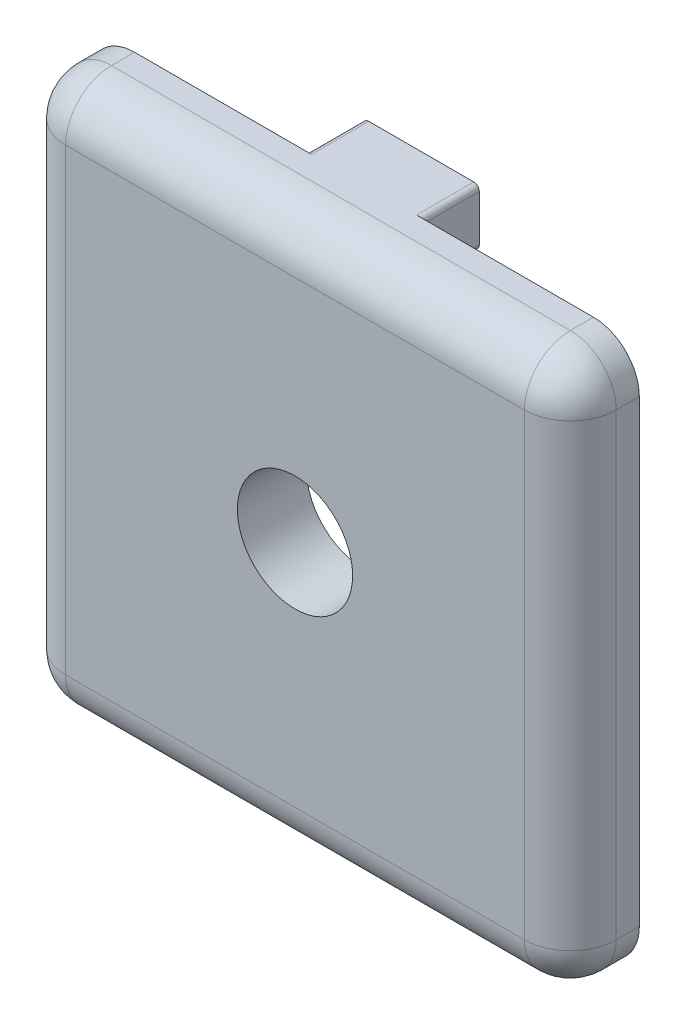
ISO-10303-21;
HEADER;
FILE_DESCRIPTION(('STEP AP214'),'2;1');
FILE_NAME('part.step','',(''),(''),'','','');
FILE_SCHEMA(('AUTOMOTIVE_DESIGN { 1 0 10303 214 1 1 1 1 }'));
ENDSEC;
DATA;
#1=APPLICATION_CONTEXT('core data for automotive mechanical design processes');
#2=APPLICATION_PROTOCOL_DEFINITION('international standard','automotive_design',2000,#1);
#3=PRODUCT_CONTEXT('',#1,'mechanical');
#4=PRODUCT('Part','Part','',(#3));
#5=PRODUCT_RELATED_PRODUCT_CATEGORY('part','',(#4));
#6=PRODUCT_DEFINITION_FORMATION('','',#4);
#7=PRODUCT_DEFINITION_CONTEXT('part definition',#1,'design');
#8=PRODUCT_DEFINITION('design','',#6,#7);
#9=PRODUCT_DEFINITION_SHAPE('','',#8);
#10=(LENGTH_UNIT() NAMED_UNIT(*) SI_UNIT(.MILLI.,.METRE.));
#11=(NAMED_UNIT(*) PLANE_ANGLE_UNIT() SI_UNIT($,.RADIAN.));
#12=(NAMED_UNIT(*) SI_UNIT($,.STERADIAN.) SOLID_ANGLE_UNIT());
#13=UNCERTAINTY_MEASURE_WITH_UNIT(LENGTH_MEASURE(1.E-05),#10,'distance_accuracy_value','');
#14=(GEOMETRIC_REPRESENTATION_CONTEXT(3) GLOBAL_UNCERTAINTY_ASSIGNED_CONTEXT((#13)) GLOBAL_UNIT_ASSIGNED_CONTEXT((#10,
#11,#12)) REPRESENTATION_CONTEXT('',''));
#15=CARTESIAN_POINT('',(0.,0.,0.));
#16=DIRECTION('',(0.,0.,1.));
#17=DIRECTION('',(1.,0.,0.));
#18=AXIS2_PLACEMENT_3D('',#15,#16,#17);
#19=CARTESIAN_POINT('',(25.7075129438591,-21.9246157583703,0.));
#20=DIRECTION('',(0.,0.,1.));
#21=DIRECTION('',(1.,0.,0.));
#22=AXIS2_PLACEMENT_3D('',#19,#20,#21);
#23=PLANE('',#22);
#24=CARTESIAN_POINT('',(25.7075129438591,20.1268055978669,0.));
#25=DIRECTION('',(0.,0.,1.));
#26=DIRECTION('',(1.,0.,0.));
#27=AXIS2_PLACEMENT_3D('',#24,#25,#26);
#28=CIRCLE('',#27,3.98780000000001);
#29=CARTESIAN_POINT('',(29.6953129438592,20.1268055978669,0.));
#30=VERTEX_POINT('',#29);
#31=EDGE_CURVE('E241',#30,#30,#28,.T.);
#32=ORIENTED_EDGE('',*,*,#31,.T.);
#33=EDGE_LOOP('',(#32));
#34=FACE_BOUND('',#33,.T.);
#35=CARTESIAN_POINT('',(29.3397129438592,38.7958055978669,0.));
#36=DIRECTION('',(0.,0.,-1.));
#37=DIRECTION('',(-1.,0.,0.));
#38=AXIS2_PLACEMENT_3D('',#35,#36,#37);
#39=CIRCLE('',#38,0.380999999999992);
#40=CARTESIAN_POINT('',(29.3397129438592,39.176805597867,0.));
#41=VERTEX_POINT('',#40);
#42=CARTESIAN_POINT('',(29.7207129438592,38.795805597867,0.));
#43=VERTEX_POINT('',#42);
#44=EDGE_CURVE('E413',#41,#43,#39,.T.);
#45=ORIENTED_EDGE('',*,*,#44,.F.);
#46=DIRECTION('',(1.,0.,0.));
#47=VECTOR('',#46,1.);
#48=CARTESIAN_POINT('',(25.7075129438591,39.176805597867,0.));
#49=LINE('',#48,#47);
#50=CARTESIAN_POINT('',(41.5825129438591,39.176805597867,0.));
#51=VERTEX_POINT('',#50);
#52=EDGE_CURVE('E262',#41,#51,#49,.T.);
#53=ORIENTED_EDGE('',*,*,#52,.T.);
#54=CARTESIAN_POINT('',(41.5825129438591,36.0018055978669,0.));
#55=DIRECTION('',(0.,0.,1.));
#56=DIRECTION('',(1.,0.,0.));
#57=AXIS2_PLACEMENT_3D('',#54,#55,#56);
#58=CIRCLE('',#57,3.175);
#59=CARTESIAN_POINT('',(44.7575129438591,36.0018055978669,0.));
#60=VERTEX_POINT('',#59);
#61=EDGE_CURVE('E258',#60,#51,#58,.T.);
#62=ORIENTED_EDGE('',*,*,#61,.F.);
#63=DIRECTION('',(0.,-1.,0.));
#64=VECTOR('',#63,1.);
#65=CARTESIAN_POINT('',(44.7575129438591,-21.9246157583703,0.));
#66=LINE('',#65,#64);
#67=CARTESIAN_POINT('',(44.7575129438591,4.25180559786696,0.));
#68=VERTEX_POINT('',#67);
#69=EDGE_CURVE('E254',#60,#68,#66,.T.);
#70=ORIENTED_EDGE('',*,*,#69,.T.);
#71=CARTESIAN_POINT('',(41.5825129438591,4.25180559786696,0.));
#72=DIRECTION('',(0.,0.,1.));
#73=DIRECTION('',(1.,0.,0.));
#74=AXIS2_PLACEMENT_3D('',#71,#72,#73);
#75=CIRCLE('',#74,3.17499999999999);
#76=CARTESIAN_POINT('',(41.5825129438591,1.07680559786696,0.));
#77=VERTEX_POINT('',#76);
#78=EDGE_CURVE('E250',#77,#68,#75,.T.);
#79=ORIENTED_EDGE('',*,*,#78,.F.);
#80=DIRECTION('',(1.,0.,0.));
#81=VECTOR('',#80,1.);
#82=CARTESIAN_POINT('',(25.7075129438591,1.07680559786696,0.));
#83=LINE('',#82,#81);
#84=CARTESIAN_POINT('',(9.83251294385915,1.07680559786696,0.));
#85=VERTEX_POINT('',#84);
#86=EDGE_CURVE('E245',#85,#77,#83,.T.);
#87=ORIENTED_EDGE('',*,*,#86,.F.);
#88=CARTESIAN_POINT('',(9.83251294385914,4.25180559786696,0.));
#89=DIRECTION('',(0.,0.,1.));
#90=DIRECTION('',(1.,0.,0.));
#91=AXIS2_PLACEMENT_3D('',#88,#89,#90);
#92=CIRCLE('',#91,3.175);
#93=CARTESIAN_POINT('',(6.65751294385915,4.25180559786696,0.));
#94=VERTEX_POINT('',#93);
#95=EDGE_CURVE('E240',#94,#85,#92,.T.);
#96=ORIENTED_EDGE('',*,*,#95,.F.);
#97=DIRECTION('',(0.,-1.,0.));
#98=VECTOR('',#97,1.);
#99=CARTESIAN_POINT('',(6.65751294385915,-21.9246157583703,0.));
#100=LINE('',#99,#98);
#101=CARTESIAN_POINT('',(6.65751294385915,36.0018055978669,0.));
#102=VERTEX_POINT('',#101);
#103=EDGE_CURVE('E358',#102,#94,#100,.T.);
#104=ORIENTED_EDGE('',*,*,#103,.F.);
#105=CARTESIAN_POINT('',(9.83251294385914,36.0018055978669,0.));
#106=DIRECTION('',(0.,0.,1.));
#107=DIRECTION('',(1.,0.,0.));
#108=AXIS2_PLACEMENT_3D('',#105,#106,#107);
#109=CIRCLE('',#108,3.175);
#110=CARTESIAN_POINT('',(9.83251294385915,39.176805597867,0.));
#111=VERTEX_POINT('',#110);
#112=EDGE_CURVE('E265',#111,#102,#109,.T.);
#113=ORIENTED_EDGE('',*,*,#112,.F.);
#114=CARTESIAN_POINT('',(22.0753129438591,39.176805597867,0.));
#115=VERTEX_POINT('',#114);
#116=EDGE_CURVE('E271',#111,#115,#49,.T.);
#117=ORIENTED_EDGE('',*,*,#116,.T.);
#118=CARTESIAN_POINT('',(22.0753129438591,38.7958055978669,0.));
#119=DIRECTION('',(0.,0.,-1.));
#120=DIRECTION('',(-1.,0.,0.));
#121=AXIS2_PLACEMENT_3D('',#118,#119,#120);
#122=CIRCLE('',#121,0.380999999999992);
#123=CARTESIAN_POINT('',(21.6943129438592,38.795805597867,0.));
#124=VERTEX_POINT('',#123);
#125=EDGE_CURVE('E404',#124,#115,#122,.T.);
#126=ORIENTED_EDGE('',*,*,#125,.F.);
#127=DIRECTION('',(0.,1.,0.));
#128=VECTOR('',#127,1.);
#129=CARTESIAN_POINT('',(21.6943129438592,38.795805597867,0.));
#130=LINE('',#129,#128);
#131=CARTESIAN_POINT('',(21.6943129438591,35.595405597867,0.));
#132=VERTEX_POINT('',#131);
#133=EDGE_CURVE('E414',#132,#124,#130,.T.);
#134=ORIENTED_EDGE('',*,*,#133,.F.);
#135=CARTESIAN_POINT('',(22.0753129438591,35.595405597867,0.));
#136=DIRECTION('',(0.,0.,-1.));
#137=DIRECTION('',(-1.,0.,0.));
#138=AXIS2_PLACEMENT_3D('',#135,#136,#137);
#139=CIRCLE('',#138,0.381000000000006);
#140=CARTESIAN_POINT('',(22.0753129438591,35.214405597867,0.));
#141=VERTEX_POINT('',#140);
#142=EDGE_CURVE('E419',#141,#132,#139,.T.);
#143=ORIENTED_EDGE('',*,*,#142,.F.);
#144=DIRECTION('',(-1.,0.,0.));
#145=VECTOR('',#144,1.);
#146=CARTESIAN_POINT('',(29.3397129438591,35.214405597867,0.));
#147=LINE('',#146,#145);
#148=CARTESIAN_POINT('',(29.3397129438591,35.214405597867,0.));
#149=VERTEX_POINT('',#148);
#150=EDGE_CURVE('E451',#149,#141,#147,.T.);
#151=ORIENTED_EDGE('',*,*,#150,.F.);
#152=CARTESIAN_POINT('',(29.3397129438592,35.595405597867,0.));
#153=DIRECTION('',(0.,0.,-1.));
#154=DIRECTION('',(-1.,0.,0.));
#155=AXIS2_PLACEMENT_3D('',#152,#153,#154);
#156=CIRCLE('',#155,0.381000000000006);
#157=CARTESIAN_POINT('',(29.7207129438592,35.595405597867,0.));
#158=VERTEX_POINT('',#157);
#159=EDGE_CURVE('E74',#158,#149,#156,.T.);
#160=ORIENTED_EDGE('',*,*,#159,.F.);
#161=DIRECTION('',(0.,-1.,0.));
#162=VECTOR('',#161,1.);
#163=CARTESIAN_POINT('',(29.7207129438592,38.795805597867,0.));
#164=LINE('',#163,#162);
#165=EDGE_CURVE('E67',#43,#158,#164,.T.);
#166=ORIENTED_EDGE('',*,*,#165,.F.);
#167=EDGE_LOOP('',(#45,#53,#62,#70,#79,#87,#96,#104,#113,#117,#126,#134,#143,#151,#160,#166));
#168=FACE_BOUND('',#167,.T.);
#169=ADVANCED_FACE('F46',(#34,#168),#23,.F.);
#170=CARTESIAN_POINT('',(25.7075129438591,1.07680559786696,4.7752));
#171=DIRECTION('',(0.,1.,0.));
#172=DIRECTION('',(0.,0.,1.));
#173=AXIS2_PLACEMENT_3D('',#170,#171,#172);
#174=PLANE('',#173);
#175=DIRECTION('',(0.,0.,-1.));
#176=VECTOR('',#175,1.);
#177=CARTESIAN_POINT('',(41.5825129438591,1.07680559786696,4.7752));
#178=LINE('',#177,#176);
#179=CARTESIAN_POINT('',(41.5825129438591,1.07680559786696,1.6002));
#180=VERTEX_POINT('',#179);
#181=EDGE_CURVE('E332',#180,#77,#178,.T.);
#182=ORIENTED_EDGE('',*,*,#181,.F.);
#183=DIRECTION('',(1.,0.,0.));
#184=VECTOR('',#183,1.);
#185=CARTESIAN_POINT('',(9.83251294385915,1.07680559786696,1.6002));
#186=LINE('',#185,#184);
#187=CARTESIAN_POINT('',(9.83251294385915,1.07680559786696,1.6002));
#188=VERTEX_POINT('',#187);
#189=EDGE_CURVE('E306',#180,#188,#186,.F.);
#190=ORIENTED_EDGE('',*,*,#189,.T.);
#191=DIRECTION('',(0.,0.,-1.));
#192=VECTOR('',#191,1.);
#193=CARTESIAN_POINT('',(9.83251294385915,1.07680559786696,4.7752));
#194=LINE('',#193,#192);
#195=EDGE_CURVE('E239',#188,#85,#194,.T.);
#196=ORIENTED_EDGE('',*,*,#195,.T.);
#197=ORIENTED_EDGE('',*,*,#86,.T.);
#198=EDGE_LOOP('',(#182,#190,#196,#197));
#199=FACE_BOUND('',#198,.T.);
#200=ADVANCED_FACE('F492',(#199),#174,.F.);
#201=CARTESIAN_POINT('',(41.5825129438591,4.25180559786696,4.7752));
#202=DIRECTION('',(0.,0.,-1.));
#203=DIRECTION('',(-1.,0.,0.));
#204=AXIS2_PLACEMENT_3D('',#201,#202,#203);
#205=CYLINDRICAL_SURFACE('',#204,3.17499999999999);
#206=DIRECTION('',(0.,0.,-1.));
#207=VECTOR('',#206,1.);
#208=CARTESIAN_POINT('',(44.7575129438591,4.25180559786696,4.7752));
#209=LINE('',#208,#207);
#210=CARTESIAN_POINT('',(44.7575129438591,4.25180559786696,1.6002));
#211=VERTEX_POINT('',#210);
#212=EDGE_CURVE('E335',#211,#68,#209,.T.);
#213=ORIENTED_EDGE('',*,*,#212,.F.);
#214=CARTESIAN_POINT('',(41.5825129438591,4.25180559786696,1.6002));
#215=DIRECTION('',(0.,0.,-1.));
#216=DIRECTION('',(-1.,0.,0.));
#217=AXIS2_PLACEMENT_3D('',#214,#215,#216);
#218=CIRCLE('',#217,3.17499999999999);
#219=EDGE_CURVE('E303',#211,#180,#218,.T.);
#220=ORIENTED_EDGE('',*,*,#219,.T.);
#221=ORIENTED_EDGE('',*,*,#181,.T.);
#222=ORIENTED_EDGE('',*,*,#78,.T.);
#223=EDGE_LOOP('',(#213,#220,#221,#222));
#224=FACE_BOUND('',#223,.T.);
#225=ADVANCED_FACE('F498',(#224),#205,.T.);
#226=CARTESIAN_POINT('',(44.7575129438591,-21.9246157583703,4.7752));
#227=DIRECTION('',(1.,0.,0.));
#228=DIRECTION('',(0.,0.,-1.));
#229=AXIS2_PLACEMENT_3D('',#226,#227,#228);
#230=PLANE('',#229);
#231=DIRECTION('',(0.,0.,-1.));
#232=VECTOR('',#231,1.);
#233=CARTESIAN_POINT('',(44.7575129438591,36.0018055978669,4.7752));
#234=LINE('',#233,#232);
#235=CARTESIAN_POINT('',(44.7575129438591,36.0018055978669,1.6002));
#236=VERTEX_POINT('',#235);
#237=EDGE_CURVE('E338',#236,#60,#234,.T.);
#238=ORIENTED_EDGE('',*,*,#237,.F.);
#239=DIRECTION('',(0.,-1.,0.));
#240=VECTOR('',#239,1.);
#241=CARTESIAN_POINT('',(44.7575129438591,-21.9246157583703,1.6002));
#242=LINE('',#241,#240);
#243=EDGE_CURVE('E300',#236,#211,#242,.T.);
#244=ORIENTED_EDGE('',*,*,#243,.T.);
#245=ORIENTED_EDGE('',*,*,#212,.T.);
#246=ORIENTED_EDGE('',*,*,#69,.F.);
#247=EDGE_LOOP('',(#238,#244,#245,#246));
#248=FACE_BOUND('',#247,.T.);
#249=ADVANCED_FACE('F517',(#248),#230,.T.);
#250=CARTESIAN_POINT('',(41.5825129438591,36.0018055978669,4.7752));
#251=DIRECTION('',(0.,0.,-1.));
#252=DIRECTION('',(-1.,0.,0.));
#253=AXIS2_PLACEMENT_3D('',#250,#251,#252);
#254=CYLINDRICAL_SURFACE('',#253,3.175);
#255=DIRECTION('',(0.,0.,-1.));
#256=VECTOR('',#255,1.);
#257=CARTESIAN_POINT('',(41.5825129438591,39.176805597867,4.7752));
#258=LINE('',#257,#256);
#259=CARTESIAN_POINT('',(41.5825129438591,39.176805597867,1.6002));
#260=VERTEX_POINT('',#259);
#261=EDGE_CURVE('E341',#260,#51,#258,.T.);
#262=ORIENTED_EDGE('',*,*,#261,.F.);
#263=CARTESIAN_POINT('',(41.5825129438591,36.0018055978669,1.6002));
#264=DIRECTION('',(0.,0.,-1.));
#265=DIRECTION('',(-1.,0.,0.));
#266=AXIS2_PLACEMENT_3D('',#263,#264,#265);
#267=CIRCLE('',#266,3.175);
#268=EDGE_CURVE('E56',#260,#236,#267,.T.);
#269=ORIENTED_EDGE('',*,*,#268,.T.);
#270=ORIENTED_EDGE('',*,*,#237,.T.);
#271=ORIENTED_EDGE('',*,*,#61,.T.);
#272=EDGE_LOOP('',(#262,#269,#270,#271));
#273=FACE_BOUND('',#272,.T.);
#274=ADVANCED_FACE('F514',(#273),#254,.T.);
#275=CARTESIAN_POINT('',(25.7075129438591,39.176805597867,4.7752));
#276=DIRECTION('',(0.,1.,0.));
#277=DIRECTION('',(0.,0.,1.));
#278=AXIS2_PLACEMENT_3D('',#275,#276,#277);
#279=PLANE('',#278);
#280=DIRECTION('',(0.,0.,-1.));
#281=VECTOR('',#280,1.);
#282=CARTESIAN_POINT('',(9.83251294385915,39.176805597867,4.7752));
#283=LINE('',#282,#281);
#284=CARTESIAN_POINT('',(9.83251294385915,39.176805597867,1.6002));
#285=VERTEX_POINT('',#284);
#286=EDGE_CURVE('E345',#285,#111,#283,.T.);
#287=ORIENTED_EDGE('',*,*,#286,.F.);
#288=DIRECTION('',(1.,0.,0.));
#289=VECTOR('',#288,1.);
#290=CARTESIAN_POINT('',(25.7075129438591,39.176805597867,1.6002));
#291=LINE('',#290,#289);
#292=EDGE_CURVE('E11',#285,#260,#291,.T.);
#293=ORIENTED_EDGE('',*,*,#292,.T.);
#294=ORIENTED_EDGE('',*,*,#261,.T.);
#295=ORIENTED_EDGE('',*,*,#52,.F.);
#296=DIRECTION('',(0.,0.,1.));
#297=VECTOR('',#296,1.);
#298=CARTESIAN_POINT('',(29.3397129438591,39.1768055978669,-3.9624));
#299=LINE('',#298,#297);
#300=CARTESIAN_POINT('',(29.3397129438591,39.1768055978669,-3.9624));
#301=VERTEX_POINT('',#300);
#302=EDGE_CURVE('E436',#301,#41,#299,.T.);
#303=ORIENTED_EDGE('',*,*,#302,.F.);
#304=DIRECTION('',(1.,0.,0.));
#305=VECTOR('',#304,1.);
#306=CARTESIAN_POINT('',(22.0753129438591,39.1768055978669,-3.9624));
#307=LINE('',#306,#305);
#308=CARTESIAN_POINT('',(22.0753129438591,39.1768055978669,-3.9624));
#309=VERTEX_POINT('',#308);
#310=EDGE_CURVE('E463',#309,#301,#307,.T.);
#311=ORIENTED_EDGE('',*,*,#310,.F.);
#312=DIRECTION('',(0.,0.,1.));
#313=VECTOR('',#312,1.);
#314=CARTESIAN_POINT('',(22.0753129438591,39.1768055978669,-3.9624));
#315=LINE('',#314,#313);
#316=EDGE_CURVE('E402',#309,#115,#315,.T.);
#317=ORIENTED_EDGE('',*,*,#316,.T.);
#318=ORIENTED_EDGE('',*,*,#116,.F.);
#319=EDGE_LOOP('',(#287,#293,#294,#295,#303,#311,#317,#318));
#320=FACE_BOUND('',#319,.T.);
#321=ADVANCED_FACE('F397',(#320),#279,.T.);
#322=CARTESIAN_POINT('',(9.83251294385914,36.0018055978669,4.7752));
#323=DIRECTION('',(0.,0.,-1.));
#324=DIRECTION('',(-1.,0.,0.));
#325=AXIS2_PLACEMENT_3D('',#322,#323,#324);
#326=CYLINDRICAL_SURFACE('',#325,3.175);
#327=DIRECTION('',(0.,0.,-1.));
#328=VECTOR('',#327,1.);
#329=CARTESIAN_POINT('',(6.65751294385915,36.0018055978669,4.7752));
#330=LINE('',#329,#328);
#331=CARTESIAN_POINT('',(6.65751294385915,36.0018055978669,1.6002));
#332=VERTEX_POINT('',#331);
#333=EDGE_CURVE('E348',#332,#102,#330,.T.);
#334=ORIENTED_EDGE('',*,*,#333,.F.);
#335=CARTESIAN_POINT('',(9.83251294385914,36.0018055978669,1.6002));
#336=DIRECTION('',(0.,0.,-1.));
#337=DIRECTION('',(-1.,0.,0.));
#338=AXIS2_PLACEMENT_3D('',#335,#336,#337);
#339=CIRCLE('',#338,3.175);
#340=EDGE_CURVE('E328',#332,#285,#339,.T.);
#341=ORIENTED_EDGE('',*,*,#340,.T.);
#342=ORIENTED_EDGE('',*,*,#286,.T.);
#343=ORIENTED_EDGE('',*,*,#112,.T.);
#344=EDGE_LOOP('',(#334,#341,#342,#343));
#345=FACE_BOUND('',#344,.T.);
#346=ADVANCED_FACE('F371',(#345),#326,.T.);
#347=CARTESIAN_POINT('',(6.65751294385915,-21.9246157583703,4.7752));
#348=DIRECTION('',(1.,0.,0.));
#349=DIRECTION('',(0.,0.,-1.));
#350=AXIS2_PLACEMENT_3D('',#347,#348,#349);
#351=PLANE('',#350);
#352=DIRECTION('',(0.,0.,-1.));
#353=VECTOR('',#352,1.);
#354=CARTESIAN_POINT('',(6.65751294385915,4.25180559786696,4.7752));
#355=LINE('',#354,#353);
#356=CARTESIAN_POINT('',(6.65751294385915,4.25180559786696,1.6002));
#357=VERTEX_POINT('',#356);
#358=EDGE_CURVE('E351',#357,#94,#355,.T.);
#359=ORIENTED_EDGE('',*,*,#358,.F.);
#360=DIRECTION('',(0.,-1.,0.));
#361=VECTOR('',#360,1.);
#362=CARTESIAN_POINT('',(6.65751294385915,36.0018055978669,1.6002));
#363=LINE('',#362,#361);
#364=EDGE_CURVE('E312',#357,#332,#363,.F.);
#365=ORIENTED_EDGE('',*,*,#364,.T.);
#366=ORIENTED_EDGE('',*,*,#333,.T.);
#367=ORIENTED_EDGE('',*,*,#103,.T.);
#368=EDGE_LOOP('',(#359,#365,#366,#367));
#369=FACE_BOUND('',#368,.T.);
#370=ADVANCED_FACE('F383',(#369),#351,.F.);
#371=CARTESIAN_POINT('',(25.7075129438591,20.1268055978669,4.7752));
#372=DIRECTION('',(0.,0.,-1.));
#373=DIRECTION('',(-1.,0.,0.));
#374=AXIS2_PLACEMENT_3D('',#371,#372,#373);
#375=CYLINDRICAL_SURFACE('',#374,3.98780000000001);
#376=CARTESIAN_POINT('',(25.7075129438591,20.1268055978669,4.7752));
#377=DIRECTION('',(0.,0.,1.));
#378=DIRECTION('',(1.,0.,0.));
#379=AXIS2_PLACEMENT_3D('',#376,#377,#378);
#380=CIRCLE('',#379,3.98780000000001);
#381=CARTESIAN_POINT('',(29.6953129438592,20.1268055978669,4.7752));
#382=VERTEX_POINT('',#381);
#383=EDGE_CURVE('E235',#382,#382,#380,.T.);
#384=ORIENTED_EDGE('',*,*,#383,.T.);
#385=EDGE_LOOP('',(#384));
#386=FACE_BOUND('',#385,.T.);
#387=ORIENTED_EDGE('',*,*,#31,.F.);
#388=EDGE_LOOP('',(#387));
#389=FACE_BOUND('',#388,.T.);
#390=ADVANCED_FACE('F507',(#386,#389),#375,.F.);
#391=CARTESIAN_POINT('',(9.83251294385914,4.25180559786696,4.7752));
#392=DIRECTION('',(0.,0.,-1.));
#393=DIRECTION('',(-1.,0.,0.));
#394=AXIS2_PLACEMENT_3D('',#391,#392,#393);
#395=CYLINDRICAL_SURFACE('',#394,3.175);
#396=ORIENTED_EDGE('',*,*,#195,.F.);
#397=CARTESIAN_POINT('',(9.83251294385914,4.25180559786696,1.6002));
#398=DIRECTION('',(0.,0.,-1.));
#399=DIRECTION('',(-1.,0.,0.));
#400=AXIS2_PLACEMENT_3D('',#397,#398,#399);
#401=CIRCLE('',#400,3.175);
#402=EDGE_CURVE('E309',#188,#357,#401,.T.);
#403=ORIENTED_EDGE('',*,*,#402,.T.);
#404=ORIENTED_EDGE('',*,*,#358,.T.);
#405=ORIENTED_EDGE('',*,*,#95,.T.);
#406=EDGE_LOOP('',(#396,#403,#404,#405));
#407=FACE_BOUND('',#406,.T.);
#408=ADVANCED_FACE('F379',(#407),#395,.T.);
#409=CARTESIAN_POINT('',(25.7075129438591,-21.9246157583703,4.7752));
#410=DIRECTION('',(0.,0.,1.));
#411=DIRECTION('',(1.,0.,0.));
#412=AXIS2_PLACEMENT_3D('',#409,#410,#411);
#413=PLANE('',#412);
#414=DIRECTION('',(1.,0.,0.));
#415=VECTOR('',#414,1.);
#416=CARTESIAN_POINT('',(25.7075129438591,36.001805597867,4.7752));
#417=LINE('',#416,#415);
#418=CARTESIAN_POINT('',(41.5825129438591,36.001805597867,4.7752));
#419=VERTEX_POINT('',#418);
#420=CARTESIAN_POINT('',(9.83251294385914,36.001805597867,4.7752));
#421=VERTEX_POINT('',#420);
#422=EDGE_CURVE('E325',#419,#421,#417,.F.);
#423=ORIENTED_EDGE('',*,*,#422,.T.);
#424=DIRECTION('',(0.,-1.,0.));
#425=VECTOR('',#424,1.);
#426=CARTESIAN_POINT('',(9.83251294385915,4.25180559786696,4.7752));
#427=LINE('',#426,#425);
#428=CARTESIAN_POINT('',(9.83251294385914,4.25180559786696,4.7752));
#429=VERTEX_POINT('',#428);
#430=EDGE_CURVE('E315',#421,#429,#427,.T.);
#431=ORIENTED_EDGE('',*,*,#430,.T.);
#432=DIRECTION('',(1.,0.,0.));
#433=VECTOR('',#432,1.);
#434=CARTESIAN_POINT('',(41.5825129438591,4.25180559786696,4.7752));
#435=LINE('',#434,#433);
#436=CARTESIAN_POINT('',(41.5825129438591,4.25180559786696,4.7752));
#437=VERTEX_POINT('',#436);
#438=EDGE_CURVE('E319',#429,#437,#435,.T.);
#439=ORIENTED_EDGE('',*,*,#438,.T.);
#440=DIRECTION('',(0.,-1.,0.));
#441=VECTOR('',#440,1.);
#442=CARTESIAN_POINT('',(41.5825129438591,-21.9246157583703,4.7752));
#443=LINE('',#442,#441);
#444=EDGE_CURVE('E322',#437,#419,#443,.F.);
#445=ORIENTED_EDGE('',*,*,#444,.T.);
#446=EDGE_LOOP('',(#423,#431,#439,#445));
#447=FACE_BOUND('',#446,.T.);
#448=ORIENTED_EDGE('',*,*,#383,.F.);
#449=EDGE_LOOP('',(#448));
#450=FACE_BOUND('',#449,.T.);
#451=ADVANCED_FACE('F503',(#447,#450),#413,.T.);
#452=CARTESIAN_POINT('',(41.5825129438591,4.25180559786696,1.6002));
#453=DIRECTION('',(0.,0.,1.));
#454=DIRECTION('',(1.,0.,0.));
#455=AXIS2_PLACEMENT_3D('',#452,#453,#454);
#456=SPHERICAL_SURFACE('',#455,3.175);
#457=CARTESIAN_POINT('',(41.5825129438591,4.25180559786697,1.6002));
#458=DIRECTION('',(-1.,0.,0.));
#459=DIRECTION('',(0.,0.,1.));
#460=AXIS2_PLACEMENT_3D('',#457,#458,#459);
#461=CIRCLE('',#460,3.175);
#462=EDGE_CURVE('E277',#180,#437,#461,.T.);
#463=ORIENTED_EDGE('',*,*,#462,.F.);
#464=ORIENTED_EDGE('',*,*,#219,.F.);
#465=CARTESIAN_POINT('',(41.5825129438591,4.25180559786696,1.6002));
#466=DIRECTION('',(0.,1.,0.));
#467=DIRECTION('',(-1.,0.,0.));
#468=AXIS2_PLACEMENT_3D('',#465,#466,#467);
#469=CIRCLE('',#468,3.175);
#470=EDGE_CURVE('E246',#437,#211,#469,.T.);
#471=ORIENTED_EDGE('',*,*,#470,.F.);
#472=EDGE_LOOP('',(#463,#464,#471));
#473=FACE_BOUND('',#472,.T.);
#474=ADVANCED_FACE('F48',(#473),#456,.T.);
#475=CARTESIAN_POINT('',(41.5825129438591,-21.9246157583703,1.6002));
#476=DIRECTION('',(0.,-1.,0.));
#477=DIRECTION('',(0.,0.,-1.));
#478=AXIS2_PLACEMENT_3D('',#475,#476,#477);
#479=CYLINDRICAL_SURFACE('',#478,3.175);
#480=ORIENTED_EDGE('',*,*,#470,.T.);
#481=ORIENTED_EDGE('',*,*,#243,.F.);
#482=CARTESIAN_POINT('',(41.5825129438591,36.0018055978669,1.6002));
#483=DIRECTION('',(0.,1.,0.));
#484=DIRECTION('',(0.,0.,1.));
#485=AXIS2_PLACEMENT_3D('',#482,#483,#484);
#486=CIRCLE('',#485,3.175);
#487=EDGE_CURVE('E281',#419,#236,#486,.T.);
#488=ORIENTED_EDGE('',*,*,#487,.F.);
#489=ORIENTED_EDGE('',*,*,#444,.F.);
#490=EDGE_LOOP('',(#480,#481,#488,#489));
#491=FACE_BOUND('',#490,.T.);
#492=ADVANCED_FACE('F544',(#491),#479,.T.);
#493=CARTESIAN_POINT('',(25.7075129438591,4.25180559786696,1.6002));
#494=DIRECTION('',(-1.,0.,0.));
#495=DIRECTION('',(0.,0.,1.));
#496=AXIS2_PLACEMENT_3D('',#493,#494,#495);
#497=CYLINDRICAL_SURFACE('',#496,3.175);
#498=ORIENTED_EDGE('',*,*,#462,.T.);
#499=ORIENTED_EDGE('',*,*,#438,.F.);
#500=CARTESIAN_POINT('',(9.83251294385915,4.25180559786696,1.6002));
#501=DIRECTION('',(-1.,0.,0.));
#502=DIRECTION('',(0.,0.,1.));
#503=AXIS2_PLACEMENT_3D('',#500,#501,#502);
#504=CIRCLE('',#503,3.175);
#505=EDGE_CURVE('E285',#188,#429,#504,.T.);
#506=ORIENTED_EDGE('',*,*,#505,.F.);
#507=ORIENTED_EDGE('',*,*,#189,.F.);
#508=EDGE_LOOP('',(#498,#499,#506,#507));
#509=FACE_BOUND('',#508,.T.);
#510=ADVANCED_FACE('F541',(#509),#497,.T.);
#511=CARTESIAN_POINT('',(41.5825129438591,36.0018055978669,1.6002));
#512=DIRECTION('',(0.,0.,1.));
#513=DIRECTION('',(1.,0.,0.));
#514=AXIS2_PLACEMENT_3D('',#511,#512,#513);
#515=SPHERICAL_SURFACE('',#514,3.175);
#516=ORIENTED_EDGE('',*,*,#487,.T.);
#517=ORIENTED_EDGE('',*,*,#268,.F.);
#518=CARTESIAN_POINT('',(41.5825129438591,36.0018055978669,1.6002));
#519=DIRECTION('',(-1.,0.,0.));
#520=DIRECTION('',(0.,0.,1.));
#521=AXIS2_PLACEMENT_3D('',#518,#519,#520);
#522=CIRCLE('',#521,3.175);
#523=EDGE_CURVE('E289',#419,#260,#522,.T.);
#524=ORIENTED_EDGE('',*,*,#523,.F.);
#525=EDGE_LOOP('',(#516,#517,#524));
#526=FACE_BOUND('',#525,.T.);
#527=ADVANCED_FACE('F538',(#526),#515,.T.);
#528=CARTESIAN_POINT('',(9.83251294385914,4.25180559786696,1.6002));
#529=DIRECTION('',(0.,0.,1.));
#530=DIRECTION('',(1.,0.,0.));
#531=AXIS2_PLACEMENT_3D('',#528,#529,#530);
#532=SPHERICAL_SURFACE('',#531,3.175);
#533=ORIENTED_EDGE('',*,*,#402,.F.);
#534=ORIENTED_EDGE('',*,*,#505,.T.);
#535=CARTESIAN_POINT('',(9.83251294385915,4.25180559786696,1.6002));
#536=DIRECTION('',(0.,1.,0.));
#537=DIRECTION('',(-1.,0.,0.));
#538=AXIS2_PLACEMENT_3D('',#535,#536,#537);
#539=CIRCLE('',#538,3.175);
#540=EDGE_CURVE('E293',#357,#429,#539,.T.);
#541=ORIENTED_EDGE('',*,*,#540,.F.);
#542=EDGE_LOOP('',(#533,#534,#541));
#543=FACE_BOUND('',#542,.T.);
#544=ADVANCED_FACE('F386',(#543),#532,.T.);
#545=CARTESIAN_POINT('',(25.7075129438591,36.001805597867,1.6002));
#546=DIRECTION('',(1.,0.,0.));
#547=DIRECTION('',(0.,0.,-1.));
#548=AXIS2_PLACEMENT_3D('',#545,#546,#547);
#549=CYLINDRICAL_SURFACE('',#548,3.175);
#550=ORIENTED_EDGE('',*,*,#523,.T.);
#551=ORIENTED_EDGE('',*,*,#292,.F.);
#552=CARTESIAN_POINT('',(9.83251294385914,36.001805597867,1.6002));
#553=DIRECTION('',(-1.,0.,0.));
#554=DIRECTION('',(0.,-1.,0.));
#555=AXIS2_PLACEMENT_3D('',#552,#553,#554);
#556=CIRCLE('',#555,3.175);
#557=EDGE_CURVE('E228',#421,#285,#556,.T.);
#558=ORIENTED_EDGE('',*,*,#557,.F.);
#559=ORIENTED_EDGE('',*,*,#422,.F.);
#560=EDGE_LOOP('',(#550,#551,#558,#559));
#561=FACE_BOUND('',#560,.T.);
#562=ADVANCED_FACE('F532',(#561),#549,.T.);
#563=CARTESIAN_POINT('',(9.83251294385915,-21.9246157583703,1.6002));
#564=DIRECTION('',(0.,1.,0.));
#565=DIRECTION('',(0.,0.,1.));
#566=AXIS2_PLACEMENT_3D('',#563,#564,#565);
#567=CYLINDRICAL_SURFACE('',#566,3.175);
#568=ORIENTED_EDGE('',*,*,#540,.T.);
#569=ORIENTED_EDGE('',*,*,#430,.F.);
#570=CARTESIAN_POINT('',(9.83251294385915,36.0018055978669,1.6002));
#571=DIRECTION('',(0.,1.,0.));
#572=DIRECTION('',(0.,0.,1.));
#573=AXIS2_PLACEMENT_3D('',#570,#571,#572);
#574=CIRCLE('',#573,3.175);
#575=EDGE_CURVE('E222',#332,#421,#574,.T.);
#576=ORIENTED_EDGE('',*,*,#575,.F.);
#577=ORIENTED_EDGE('',*,*,#364,.F.);
#578=EDGE_LOOP('',(#568,#569,#576,#577));
#579=FACE_BOUND('',#578,.T.);
#580=ADVANCED_FACE('F391',(#579),#567,.T.);
#581=CARTESIAN_POINT('',(9.83251294385914,36.0018055978669,1.6002));
#582=DIRECTION('',(0.,0.,1.));
#583=DIRECTION('',(1.,0.,0.));
#584=AXIS2_PLACEMENT_3D('',#581,#582,#583);
#585=SPHERICAL_SURFACE('',#584,3.175);
#586=ORIENTED_EDGE('',*,*,#557,.T.);
#587=ORIENTED_EDGE('',*,*,#340,.F.);
#588=ORIENTED_EDGE('',*,*,#575,.T.);
#589=EDGE_LOOP('',(#586,#587,#588));
#590=FACE_BOUND('',#589,.T.);
#591=ADVANCED_FACE('F394',(#590),#585,.T.);
#592=CARTESIAN_POINT('',(29.3397129438592,35.595405597867,-3.9624));
#593=DIRECTION('',(0.,0.,1.));
#594=DIRECTION('',(1.,0.,0.));
#595=AXIS2_PLACEMENT_3D('',#592,#593,#594);
#596=CYLINDRICAL_SURFACE('',#595,0.381000000000006);
#597=ORIENTED_EDGE('',*,*,#159,.T.);
#598=DIRECTION('',(0.,0.,1.));
#599=VECTOR('',#598,1.);
#600=CARTESIAN_POINT('',(29.3397129438591,35.214405597867,-3.9624));
#601=LINE('',#600,#599);
#602=CARTESIAN_POINT('',(29.3397129438591,35.214405597867,-3.9624));
#603=VERTEX_POINT('',#602);
#604=EDGE_CURVE('E202',#603,#149,#601,.T.);
#605=ORIENTED_EDGE('',*,*,#604,.F.);
#606=CARTESIAN_POINT('',(29.3397129438592,35.595405597867,-3.9624));
#607=DIRECTION('',(0.,0.,-1.));
#608=DIRECTION('',(-1.,0.,0.));
#609=AXIS2_PLACEMENT_3D('',#606,#607,#608);
#610=CIRCLE('',#609,0.381000000000006);
#611=CARTESIAN_POINT('',(29.7207129438592,35.595405597867,-3.9624));
#612=VERTEX_POINT('',#611);
#613=EDGE_CURVE('E209',#612,#603,#610,.T.);
#614=ORIENTED_EDGE('',*,*,#613,.F.);
#615=DIRECTION('',(0.,0.,1.));
#616=VECTOR('',#615,1.);
#617=CARTESIAN_POINT('',(29.7207129438592,35.595405597867,-3.9624));
#618=LINE('',#617,#616);
#619=EDGE_CURVE('E430',#612,#158,#618,.T.);
#620=ORIENTED_EDGE('',*,*,#619,.T.);
#621=EDGE_LOOP('',(#597,#605,#614,#620));
#622=FACE_BOUND('',#621,.T.);
#623=ADVANCED_FACE('F220',(#622),#596,.T.);
#624=CARTESIAN_POINT('',(29.3397129438591,35.214405597867,-3.9624));
#625=DIRECTION('',(0.,1.,0.));
#626=DIRECTION('',(0.,0.,1.));
#627=AXIS2_PLACEMENT_3D('',#624,#625,#626);
#628=PLANE('',#627);
#629=ORIENTED_EDGE('',*,*,#150,.T.);
#630=DIRECTION('',(0.,0.,1.));
#631=VECTOR('',#630,1.);
#632=CARTESIAN_POINT('',(22.0753129438591,35.214405597867,-3.9624));
#633=LINE('',#632,#631);
#634=CARTESIAN_POINT('',(22.0753129438591,35.214405597867,-3.9624));
#635=VERTEX_POINT('',#634);
#636=EDGE_CURVE('E204',#635,#141,#633,.T.);
#637=ORIENTED_EDGE('',*,*,#636,.F.);
#638=DIRECTION('',(-1.,0.,0.));
#639=VECTOR('',#638,1.);
#640=CARTESIAN_POINT('',(29.3397129438591,35.214405597867,-3.9624));
#641=LINE('',#640,#639);
#642=EDGE_CURVE('E197',#603,#635,#641,.T.);
#643=ORIENTED_EDGE('',*,*,#642,.F.);
#644=ORIENTED_EDGE('',*,*,#604,.T.);
#645=EDGE_LOOP('',(#629,#637,#643,#644));
#646=FACE_BOUND('',#645,.T.);
#647=ADVANCED_FACE('F200',(#646),#628,.F.);
#648=CARTESIAN_POINT('',(22.0753129438591,35.595405597867,-3.9624));
#649=DIRECTION('',(0.,0.,1.));
#650=DIRECTION('',(1.,0.,0.));
#651=AXIS2_PLACEMENT_3D('',#648,#649,#650);
#652=CYLINDRICAL_SURFACE('',#651,0.381000000000006);
#653=ORIENTED_EDGE('',*,*,#142,.T.);
#654=DIRECTION('',(0.,0.,1.));
#655=VECTOR('',#654,1.);
#656=CARTESIAN_POINT('',(21.6943129438591,35.595405597867,-3.9624));
#657=LINE('',#656,#655);
#658=CARTESIAN_POINT('',(21.6943129438591,35.595405597867,-3.9624));
#659=VERTEX_POINT('',#658);
#660=EDGE_CURVE('E231',#659,#132,#657,.T.);
#661=ORIENTED_EDGE('',*,*,#660,.F.);
#662=CARTESIAN_POINT('',(22.0753129438591,35.595405597867,-3.9624));
#663=DIRECTION('',(0.,0.,-1.));
#664=DIRECTION('',(-1.,0.,0.));
#665=AXIS2_PLACEMENT_3D('',#662,#663,#664);
#666=CIRCLE('',#665,0.381000000000006);
#667=EDGE_CURVE('E208',#635,#659,#666,.T.);
#668=ORIENTED_EDGE('',*,*,#667,.F.);
#669=ORIENTED_EDGE('',*,*,#636,.T.);
#670=EDGE_LOOP('',(#653,#661,#668,#669));
#671=FACE_BOUND('',#670,.T.);
#672=ADVANCED_FACE('F450',(#671),#652,.T.);
#673=CARTESIAN_POINT('',(21.6943129438592,38.795805597867,-3.9624));
#674=DIRECTION('',(1.,0.,0.));
#675=DIRECTION('',(0.,0.,-1.));
#676=AXIS2_PLACEMENT_3D('',#673,#674,#675);
#677=PLANE('',#676);
#678=ORIENTED_EDGE('',*,*,#133,.T.);
#679=DIRECTION('',(0.,0.,1.));
#680=VECTOR('',#679,1.);
#681=CARTESIAN_POINT('',(21.6943129438592,38.795805597867,-3.9624));
#682=LINE('',#681,#680);
#683=CARTESIAN_POINT('',(21.6943129438592,38.795805597867,-3.9624));
#684=VERTEX_POINT('',#683);
#685=EDGE_CURVE('E411',#684,#124,#682,.T.);
#686=ORIENTED_EDGE('',*,*,#685,.F.);
#687=DIRECTION('',(0.,1.,0.));
#688=VECTOR('',#687,1.);
#689=CARTESIAN_POINT('',(21.6943129438592,38.795805597867,-3.9624));
#690=LINE('',#689,#688);
#691=EDGE_CURVE('E447',#659,#684,#690,.T.);
#692=ORIENTED_EDGE('',*,*,#691,.F.);
#693=ORIENTED_EDGE('',*,*,#660,.T.);
#694=EDGE_LOOP('',(#678,#686,#692,#693));
#695=FACE_BOUND('',#694,.T.);
#696=ADVANCED_FACE('F446',(#695),#677,.F.);
#697=CARTESIAN_POINT('',(22.0753129438591,38.7958055978669,-3.9624));
#698=DIRECTION('',(0.,0.,1.));
#699=DIRECTION('',(1.,0.,0.));
#700=AXIS2_PLACEMENT_3D('',#697,#698,#699);
#701=CYLINDRICAL_SURFACE('',#700,0.380999999999992);
#702=ORIENTED_EDGE('',*,*,#125,.T.);
#703=ORIENTED_EDGE('',*,*,#316,.F.);
#704=CARTESIAN_POINT('',(22.0753129438591,38.7958055978669,-3.9624));
#705=DIRECTION('',(0.,0.,-1.));
#706=DIRECTION('',(-1.,0.,0.));
#707=AXIS2_PLACEMENT_3D('',#704,#705,#706);
#708=CIRCLE('',#707,0.380999999999992);
#709=EDGE_CURVE('E466',#684,#309,#708,.T.);
#710=ORIENTED_EDGE('',*,*,#709,.F.);
#711=ORIENTED_EDGE('',*,*,#685,.T.);
#712=EDGE_LOOP('',(#702,#703,#710,#711));
#713=FACE_BOUND('',#712,.T.);
#714=ADVANCED_FACE('F408',(#713),#701,.T.);
#715=CARTESIAN_POINT('',(29.3397129438592,38.7958055978669,-3.9624));
#716=DIRECTION('',(0.,0.,1.));
#717=DIRECTION('',(1.,0.,0.));
#718=AXIS2_PLACEMENT_3D('',#715,#716,#717);
#719=CYLINDRICAL_SURFACE('',#718,0.380999999999992);
#720=ORIENTED_EDGE('',*,*,#44,.T.);
#721=DIRECTION('',(0.,0.,1.));
#722=VECTOR('',#721,1.);
#723=CARTESIAN_POINT('',(29.7207129438592,38.795805597867,-3.9624));
#724=LINE('',#723,#722);
#725=CARTESIAN_POINT('',(29.7207129438592,38.795805597867,-3.9624));
#726=VERTEX_POINT('',#725);
#727=EDGE_CURVE('E432',#726,#43,#724,.T.);
#728=ORIENTED_EDGE('',*,*,#727,.F.);
#729=CARTESIAN_POINT('',(29.3397129438592,38.7958055978669,-3.9624));
#730=DIRECTION('',(0.,0.,-1.));
#731=DIRECTION('',(-1.,0.,0.));
#732=AXIS2_PLACEMENT_3D('',#729,#730,#731);
#733=CIRCLE('',#732,0.380999999999992);
#734=EDGE_CURVE('E460',#301,#726,#733,.T.);
#735=ORIENTED_EDGE('',*,*,#734,.F.);
#736=ORIENTED_EDGE('',*,*,#302,.T.);
#737=EDGE_LOOP('',(#720,#728,#735,#736));
#738=FACE_BOUND('',#737,.T.);
#739=ADVANCED_FACE('F480',(#738),#719,.T.);
#740=CARTESIAN_POINT('',(29.7207129438592,38.795805597867,-3.9624));
#741=DIRECTION('',(-1.,0.,0.));
#742=DIRECTION('',(0.,0.,1.));
#743=AXIS2_PLACEMENT_3D('',#740,#741,#742);
#744=PLANE('',#743);
#745=ORIENTED_EDGE('',*,*,#165,.T.);
#746=ORIENTED_EDGE('',*,*,#619,.F.);
#747=DIRECTION('',(0.,-1.,0.));
#748=VECTOR('',#747,1.);
#749=CARTESIAN_POINT('',(29.7207129438592,38.795805597867,-3.9624));
#750=LINE('',#749,#748);
#751=EDGE_CURVE('E214',#726,#612,#750,.T.);
#752=ORIENTED_EDGE('',*,*,#751,.F.);
#753=ORIENTED_EDGE('',*,*,#727,.T.);
#754=EDGE_LOOP('',(#745,#746,#752,#753));
#755=FACE_BOUND('',#754,.T.);
#756=ADVANCED_FACE('F482',(#755),#744,.F.);
#757=CARTESIAN_POINT('',(29.3397129438592,35.595405597867,-3.9624));
#758=DIRECTION('',(0.,0.,-1.));
#759=DIRECTION('',(-1.,0.,0.));
#760=AXIS2_PLACEMENT_3D('',#757,#758,#759);
#761=PLANE('',#760);
#762=ORIENTED_EDGE('',*,*,#613,.T.);
#763=ORIENTED_EDGE('',*,*,#642,.T.);
#764=ORIENTED_EDGE('',*,*,#667,.T.);
#765=ORIENTED_EDGE('',*,*,#691,.T.);
#766=ORIENTED_EDGE('',*,*,#709,.T.);
#767=ORIENTED_EDGE('',*,*,#310,.T.);
#768=ORIENTED_EDGE('',*,*,#734,.T.);
#769=ORIENTED_EDGE('',*,*,#751,.T.);
#770=EDGE_LOOP('',(#762,#763,#764,#765,#766,#767,#768,#769));
#771=FACE_BOUND('',#770,.T.);
#772=ADVANCED_FACE('F212',(#771),#761,.T.);
#773=CLOSED_SHELL('',(#169,#200,#225,#249,#274,#321,#346,#370,#390,#408,#451,#474,#492,#510,
#527,#544,#562,#580,#591,#623,#647,#672,#696,#714,#739,#756,#772));
#774=MANIFOLD_SOLID_BREP('B2',#773);
#775=ADVANCED_BREP_SHAPE_REPRESENTATION('',(#18,#774),#14);
#776=SHAPE_DEFINITION_REPRESENTATION(#9,#775);
ENDSEC;
END-ISO-10303-21;
